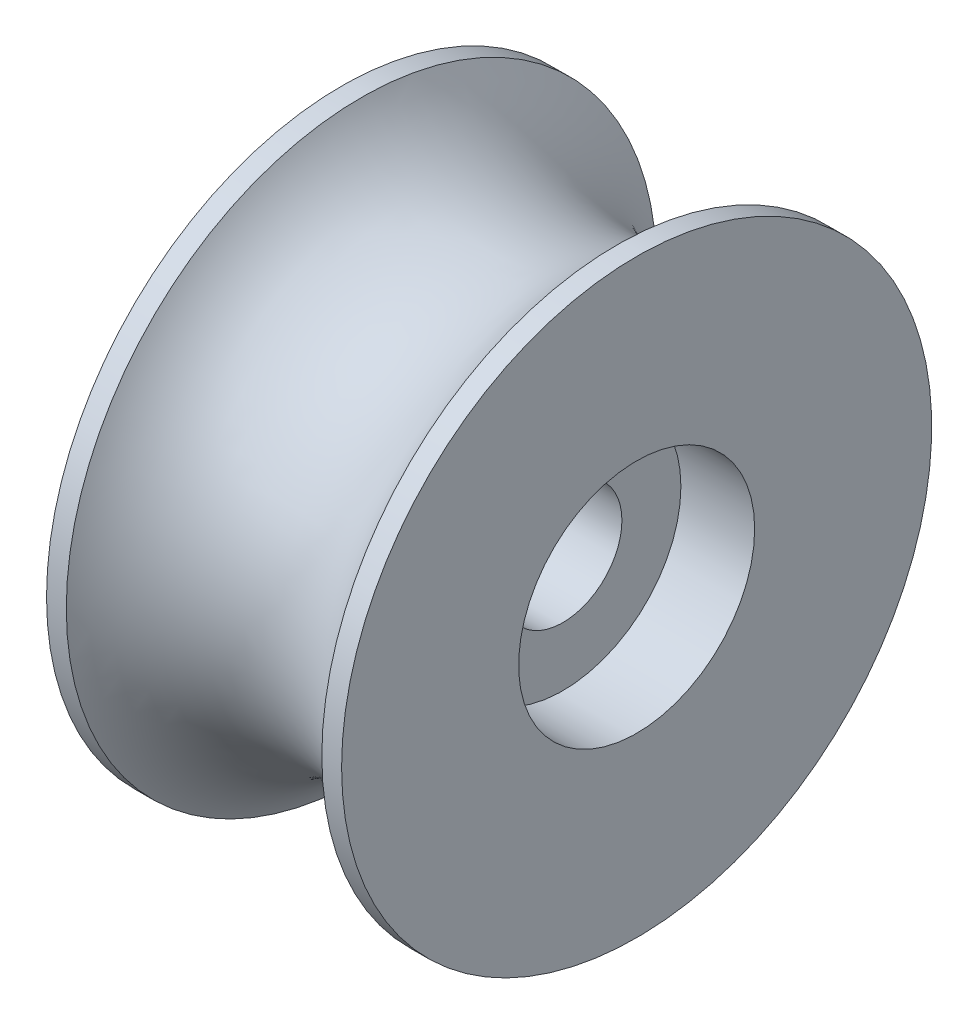
ISO-10303-21;
HEADER;
FILE_DESCRIPTION(('STEP AP214'),'2;1');
FILE_NAME('part.step','',(''),(''),'','','');
FILE_SCHEMA(('AUTOMOTIVE_DESIGN { 1 0 10303 214 1 1 1 1 }'));
ENDSEC;
DATA;
#1=APPLICATION_CONTEXT('core data for automotive mechanical design processes');
#2=APPLICATION_PROTOCOL_DEFINITION('international standard','automotive_design',2000,#1);
#3=PRODUCT_CONTEXT('',#1,'mechanical');
#4=PRODUCT('Part','Part','',(#3));
#5=PRODUCT_RELATED_PRODUCT_CATEGORY('part','',(#4));
#6=PRODUCT_DEFINITION_FORMATION('','',#4);
#7=PRODUCT_DEFINITION_CONTEXT('part definition',#1,'design');
#8=PRODUCT_DEFINITION('design','',#6,#7);
#9=PRODUCT_DEFINITION_SHAPE('','',#8);
#10=(LENGTH_UNIT() NAMED_UNIT(*) SI_UNIT(.MILLI.,.METRE.));
#11=(NAMED_UNIT(*) PLANE_ANGLE_UNIT() SI_UNIT($,.RADIAN.));
#12=(NAMED_UNIT(*) SI_UNIT($,.STERADIAN.) SOLID_ANGLE_UNIT());
#13=UNCERTAINTY_MEASURE_WITH_UNIT(LENGTH_MEASURE(1.E-05),#10,'distance_accuracy_value','');
#14=(GEOMETRIC_REPRESENTATION_CONTEXT(3) GLOBAL_UNCERTAINTY_ASSIGNED_CONTEXT((#13)) GLOBAL_UNIT_ASSIGNED_CONTEXT((#10,
#11,#12)) REPRESENTATION_CONTEXT('',''));
#15=CARTESIAN_POINT('',(0.,0.,0.));
#16=DIRECTION('',(0.,0.,1.));
#17=DIRECTION('',(1.,0.,0.));
#18=AXIS2_PLACEMENT_3D('',#15,#16,#17);
#19=CARTESIAN_POINT('',(-45.,0.,10.));
#20=DIRECTION('',(1.,0.,0.));
#21=DIRECTION('',(0.,0.,-1.));
#22=AXIS2_PLACEMENT_3D('',#19,#20,#21);
#23=CYLINDRICAL_SURFACE('',#22,4.);
#24=CARTESIAN_POINT('',(5.,0.,10.));
#25=DIRECTION('',(1.,0.,0.));
#26=DIRECTION('',(0.,0.,-1.));
#27=AXIS2_PLACEMENT_3D('',#24,#25,#26);
#28=CIRCLE('',#27,4.);
#29=CARTESIAN_POINT('',(5.,0.,6.));
#30=VERTEX_POINT('',#29);
#31=EDGE_CURVE('E49',#30,#30,#28,.F.);
#32=ORIENTED_EDGE('',*,*,#31,.F.);
#33=EDGE_LOOP('',(#32));
#34=FACE_BOUND('',#33,.T.);
#35=CARTESIAN_POINT('',(-5.,0.,10.));
#36=DIRECTION('',(-1.,0.,0.));
#37=DIRECTION('',(0.,0.,1.));
#38=AXIS2_PLACEMENT_3D('',#35,#36,#37);
#39=CIRCLE('',#38,4.);
#40=CARTESIAN_POINT('',(-5.,0.,14.));
#41=VERTEX_POINT('',#40);
#42=EDGE_CURVE('E37',#41,#41,#39,.F.);
#43=ORIENTED_EDGE('',*,*,#42,.F.);
#44=EDGE_LOOP('',(#43));
#45=FACE_BOUND('',#44,.T.);
#46=ADVANCED_FACE('F33',(#34,#45),#23,.F.);
#47=CARTESIAN_POINT('',(10.,0.,-10.));
#48=DIRECTION('',(-1.,0.,0.));
#49=DIRECTION('',(0.,0.,1.));
#50=AXIS2_PLACEMENT_3D('',#47,#48,#49);
#51=PLANE('',#50);
#52=CARTESIAN_POINT('',(10.,0.,10.));
#53=DIRECTION('',(1.,0.,0.));
#54=DIRECTION('',(0.,0.,-1.));
#55=AXIS2_PLACEMENT_3D('',#52,#53,#54);
#56=CIRCLE('',#55,8.);
#57=CARTESIAN_POINT('',(10.,0.,2.));
#58=VERTEX_POINT('',#57);
#59=EDGE_CURVE('E58',#58,#58,#56,.T.);
#60=ORIENTED_EDGE('',*,*,#59,.F.);
#61=EDGE_LOOP('',(#60));
#62=FACE_BOUND('',#61,.T.);
#63=CARTESIAN_POINT('',(10.,0.,10.));
#64=DIRECTION('',(-1.,0.,0.));
#65=DIRECTION('',(0.,0.,1.));
#66=AXIS2_PLACEMENT_3D('',#63,#64,#65);
#67=CIRCLE('',#66,20.);
#68=CARTESIAN_POINT('',(10.,0.,30.));
#69=VERTEX_POINT('',#68);
#70=EDGE_CURVE('E10',#69,#69,#67,.T.);
#71=ORIENTED_EDGE('',*,*,#70,.F.);
#72=EDGE_LOOP('',(#71));
#73=FACE_BOUND('',#72,.T.);
#74=ADVANCED_FACE('F35',(#62,#73),#51,.F.);
#75=CARTESIAN_POINT('',(-10.,0.,10.));
#76=DIRECTION('',(-1.,0.,0.));
#77=DIRECTION('',(0.,0.,1.));
#78=AXIS2_PLACEMENT_3D('',#75,#76,#77);
#79=CYLINDRICAL_SURFACE('',#78,20.);
#80=CARTESIAN_POINT('',(8.66025403784438,0.,10.));
#81=DIRECTION('',(-1.,0.,0.));
#82=DIRECTION('',(0.,0.,1.));
#83=AXIS2_PLACEMENT_3D('',#80,#81,#82);
#84=CIRCLE('',#83,20.);
#85=CARTESIAN_POINT('',(8.66025403784438,0.,30.));
#86=VERTEX_POINT('',#85);
#87=EDGE_CURVE('E41',#86,#86,#84,.T.);
#88=ORIENTED_EDGE('',*,*,#87,.F.);
#89=EDGE_LOOP('',(#88));
#90=FACE_BOUND('',#89,.T.);
#91=ORIENTED_EDGE('',*,*,#70,.T.);
#92=EDGE_LOOP('',(#91));
#93=FACE_BOUND('',#92,.T.);
#94=ADVANCED_FACE('F75',(#90,#93),#79,.T.);
#95=CARTESIAN_POINT('',(0.,0.,10.));
#96=DIRECTION('',(-1.,0.,0.));
#97=DIRECTION('',(0.,0.,1.));
#98=AXIS2_PLACEMENT_3D('',#95,#96,#97);
#99=TOROIDAL_SURFACE('',#98,25.,10.);
#100=CARTESIAN_POINT('',(-8.66025403784439,0.,10.));
#101=DIRECTION('',(-1.,0.,0.));
#102=DIRECTION('',(0.,0.,1.));
#103=AXIS2_PLACEMENT_3D('',#100,#101,#102);
#104=CIRCLE('',#103,20.);
#105=CARTESIAN_POINT('',(-8.66025403784439,0.,30.));
#106=VERTEX_POINT('',#105);
#107=EDGE_CURVE('E46',#106,#106,#104,.T.);
#108=ORIENTED_EDGE('',*,*,#107,.F.);
#109=EDGE_LOOP('',(#108));
#110=FACE_BOUND('',#109,.T.);
#111=ORIENTED_EDGE('',*,*,#87,.T.);
#112=EDGE_LOOP('',(#111));
#113=FACE_BOUND('',#112,.T.);
#114=ADVANCED_FACE('F72',(#110,#113),#99,.F.);
#115=CARTESIAN_POINT('',(-10.,0.,10.));
#116=DIRECTION('',(-1.,0.,0.));
#117=DIRECTION('',(0.,0.,1.));
#118=AXIS2_PLACEMENT_3D('',#115,#116,#117);
#119=CYLINDRICAL_SURFACE('',#118,20.);
#120=CARTESIAN_POINT('',(-10.,0.,10.));
#121=DIRECTION('',(-1.,0.,0.));
#122=DIRECTION('',(0.,0.,1.));
#123=AXIS2_PLACEMENT_3D('',#120,#121,#122);
#124=CIRCLE('',#123,20.);
#125=CARTESIAN_POINT('',(-10.,0.,30.));
#126=VERTEX_POINT('',#125);
#127=EDGE_CURVE('E51',#126,#126,#124,.T.);
#128=ORIENTED_EDGE('',*,*,#127,.F.);
#129=EDGE_LOOP('',(#128));
#130=FACE_BOUND('',#129,.T.);
#131=ORIENTED_EDGE('',*,*,#107,.T.);
#132=EDGE_LOOP('',(#131));
#133=FACE_BOUND('',#132,.T.);
#134=ADVANCED_FACE('F70',(#130,#133),#119,.T.);
#135=CARTESIAN_POINT('',(-10.,0.,-10.));
#136=DIRECTION('',(1.,0.,0.));
#137=DIRECTION('',(0.,0.,-1.));
#138=AXIS2_PLACEMENT_3D('',#135,#136,#137);
#139=PLANE('',#138);
#140=CARTESIAN_POINT('',(-10.,0.,10.));
#141=DIRECTION('',(-1.,0.,0.));
#142=DIRECTION('',(0.,0.,1.));
#143=AXIS2_PLACEMENT_3D('',#140,#141,#142);
#144=CIRCLE('',#143,8.);
#145=CARTESIAN_POINT('',(-10.,0.,18.));
#146=VERTEX_POINT('',#145);
#147=EDGE_CURVE('E65',#146,#146,#144,.T.);
#148=ORIENTED_EDGE('',*,*,#147,.F.);
#149=EDGE_LOOP('',(#148));
#150=FACE_BOUND('',#149,.T.);
#151=ORIENTED_EDGE('',*,*,#127,.T.);
#152=EDGE_LOOP('',(#151));
#153=FACE_BOUND('',#152,.T.);
#154=ADVANCED_FACE('F94',(#150,#153),#139,.F.);
#155=CARTESIAN_POINT('',(5.,0.,10.));
#156=DIRECTION('',(1.,0.,0.));
#157=DIRECTION('',(0.,0.,-1.));
#158=AXIS2_PLACEMENT_3D('',#155,#156,#157);
#159=PLANE('',#158);
#160=CARTESIAN_POINT('',(5.,0.,10.));
#161=DIRECTION('',(1.,0.,0.));
#162=DIRECTION('',(0.,0.,-1.));
#163=AXIS2_PLACEMENT_3D('',#160,#161,#162);
#164=CIRCLE('',#163,8.);
#165=CARTESIAN_POINT('',(5.,0.,2.));
#166=VERTEX_POINT('',#165);
#167=EDGE_CURVE('E52',#166,#166,#164,.T.);
#168=ORIENTED_EDGE('',*,*,#167,.T.);
#169=EDGE_LOOP('',(#168));
#170=FACE_BOUND('',#169,.T.);
#171=ORIENTED_EDGE('',*,*,#31,.T.);
#172=EDGE_LOOP('',(#171));
#173=FACE_BOUND('',#172,.T.);
#174=ADVANCED_FACE('F97',(#170,#173),#159,.T.);
#175=CARTESIAN_POINT('',(5.,0.,10.));
#176=DIRECTION('',(1.,0.,0.));
#177=DIRECTION('',(0.,0.,-1.));
#178=AXIS2_PLACEMENT_3D('',#175,#176,#177);
#179=CYLINDRICAL_SURFACE('',#178,8.);
#180=ORIENTED_EDGE('',*,*,#167,.F.);
#181=EDGE_LOOP('',(#180));
#182=FACE_BOUND('',#181,.T.);
#183=ORIENTED_EDGE('',*,*,#59,.T.);
#184=EDGE_LOOP('',(#183));
#185=FACE_BOUND('',#184,.T.);
#186=ADVANCED_FACE('F92',(#182,#185),#179,.F.);
#187=CARTESIAN_POINT('',(-5.,0.,10.));
#188=DIRECTION('',(-1.,0.,0.));
#189=DIRECTION('',(0.,0.,1.));
#190=AXIS2_PLACEMENT_3D('',#187,#188,#189);
#191=PLANE('',#190);
#192=CARTESIAN_POINT('',(-5.,0.,10.));
#193=DIRECTION('',(-1.,0.,0.));
#194=DIRECTION('',(0.,0.,1.));
#195=AXIS2_PLACEMENT_3D('',#192,#193,#194);
#196=CIRCLE('',#195,8.);
#197=CARTESIAN_POINT('',(-5.,0.,18.));
#198=VERTEX_POINT('',#197);
#199=EDGE_CURVE('E173',#198,#198,#196,.T.);
#200=ORIENTED_EDGE('',*,*,#199,.T.);
#201=EDGE_LOOP('',(#200));
#202=FACE_BOUND('',#201,.T.);
#203=ORIENTED_EDGE('',*,*,#42,.T.);
#204=EDGE_LOOP('',(#203));
#205=FACE_BOUND('',#204,.T.);
#206=ADVANCED_FACE('F124',(#202,#205),#191,.T.);
#207=CARTESIAN_POINT('',(-5.,0.,10.));
#208=DIRECTION('',(-1.,0.,0.));
#209=DIRECTION('',(0.,0.,1.));
#210=AXIS2_PLACEMENT_3D('',#207,#208,#209);
#211=CYLINDRICAL_SURFACE('',#210,8.);
#212=ORIENTED_EDGE('',*,*,#199,.F.);
#213=EDGE_LOOP('',(#212));
#214=FACE_BOUND('',#213,.T.);
#215=ORIENTED_EDGE('',*,*,#147,.T.);
#216=EDGE_LOOP('',(#215));
#217=FACE_BOUND('',#216,.T.);
#218=ADVANCED_FACE('F130',(#214,#217),#211,.F.);
#219=CLOSED_SHELL('',(#46,#74,#94,#114,#134,#154,#174,#186,#206,#218));
#220=MANIFOLD_SOLID_BREP('B2',#219);
#221=ADVANCED_BREP_SHAPE_REPRESENTATION('',(#18,#220),#14);
#222=SHAPE_DEFINITION_REPRESENTATION(#9,#221);
ENDSEC;
END-ISO-10303-21;
